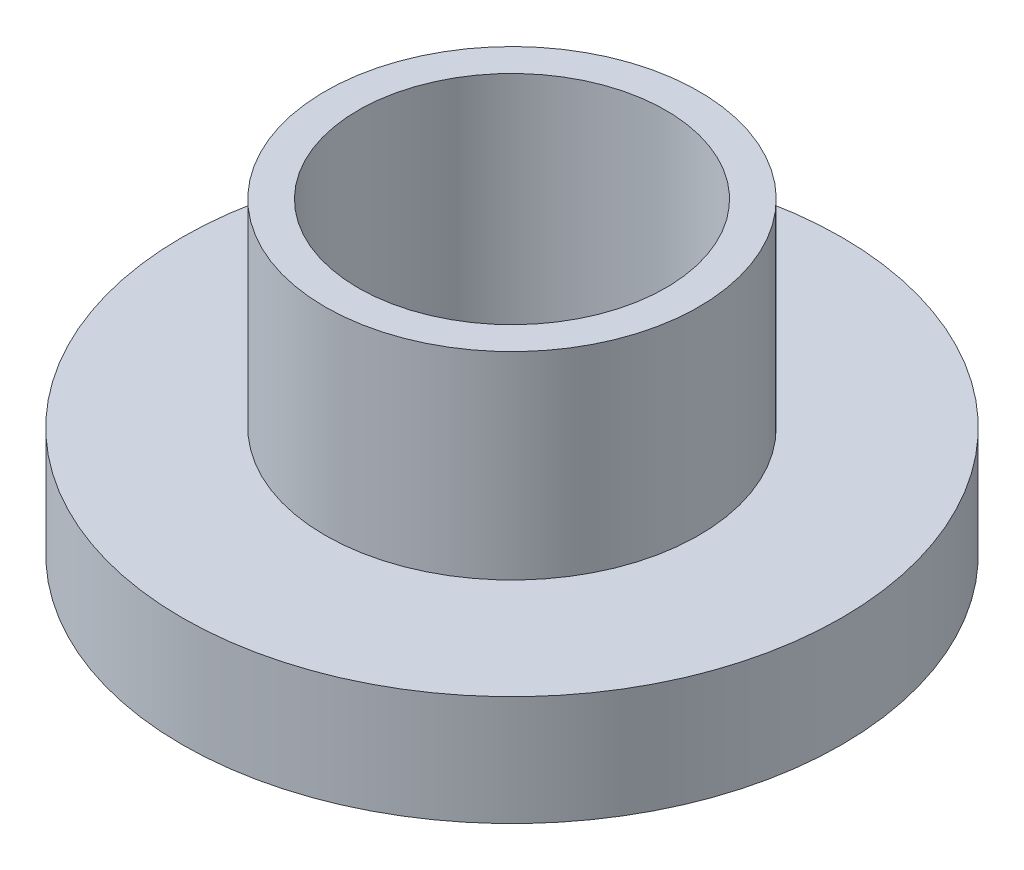
ISO-10303-21;
HEADER;
FILE_DESCRIPTION(('STEP AP214'),'2;1');
FILE_NAME('part.step','',(''),(''),'','','');
FILE_SCHEMA(('AUTOMOTIVE_DESIGN { 1 0 10303 214 1 1 1 1 }'));
ENDSEC;
DATA;
#1=APPLICATION_CONTEXT('core data for automotive mechanical design processes');
#2=APPLICATION_PROTOCOL_DEFINITION('international standard','automotive_design',2000,#1);
#3=PRODUCT_CONTEXT('',#1,'mechanical');
#4=PRODUCT('Part','Part','',(#3));
#5=PRODUCT_RELATED_PRODUCT_CATEGORY('part','',(#4));
#6=PRODUCT_DEFINITION_FORMATION('','',#4);
#7=PRODUCT_DEFINITION_CONTEXT('part definition',#1,'design');
#8=PRODUCT_DEFINITION('design','',#6,#7);
#9=PRODUCT_DEFINITION_SHAPE('','',#8);
#10=(LENGTH_UNIT() NAMED_UNIT(*) SI_UNIT(.MILLI.,.METRE.));
#11=(NAMED_UNIT(*) PLANE_ANGLE_UNIT() SI_UNIT($,.RADIAN.));
#12=(NAMED_UNIT(*) SI_UNIT($,.STERADIAN.) SOLID_ANGLE_UNIT());
#13=UNCERTAINTY_MEASURE_WITH_UNIT(LENGTH_MEASURE(1.E-05),#10,'distance_accuracy_value','');
#14=(GEOMETRIC_REPRESENTATION_CONTEXT(3) GLOBAL_UNCERTAINTY_ASSIGNED_CONTEXT((#13)) GLOBAL_UNIT_ASSIGNED_CONTEXT((#10,
#11,#12)) REPRESENTATION_CONTEXT('',''));
#15=CARTESIAN_POINT('',(0.,0.,0.));
#16=DIRECTION('',(0.,0.,1.));
#17=DIRECTION('',(1.,0.,0.));
#18=AXIS2_PLACEMENT_3D('',#15,#16,#17);
#19=CARTESIAN_POINT('',(0.,2.8,0.));
#20=DIRECTION('',(0.,-1.,0.));
#21=DIRECTION('',(0.,0.,-1.));
#22=AXIS2_PLACEMENT_3D('',#19,#20,#21);
#23=CYLINDRICAL_SURFACE('',#22,3.);
#24=CARTESIAN_POINT('',(0.,0.,0.));
#25=DIRECTION('',(0.,1.,0.));
#26=DIRECTION('',(0.,0.,1.));
#27=AXIS2_PLACEMENT_3D('',#24,#25,#26);
#28=CIRCLE('',#27,3.);
#29=CARTESIAN_POINT('',(0.,0.,3.));
#30=VERTEX_POINT('',#29);
#31=EDGE_CURVE('E12',#30,#30,#28,.T.);
#32=ORIENTED_EDGE('',*,*,#31,.T.);
#33=EDGE_LOOP('',(#32));
#34=FACE_BOUND('',#33,.T.);
#35=CARTESIAN_POINT('',(0.,1.,0.));
#36=DIRECTION('',(0.,1.,0.));
#37=DIRECTION('',(0.,0.,1.));
#38=AXIS2_PLACEMENT_3D('',#35,#36,#37);
#39=CIRCLE('',#38,3.);
#40=CARTESIAN_POINT('',(0.,1.,3.));
#41=VERTEX_POINT('',#40);
#42=EDGE_CURVE('E37',#41,#41,#39,.T.);
#43=ORIENTED_EDGE('',*,*,#42,.F.);
#44=EDGE_LOOP('',(#43));
#45=FACE_BOUND('',#44,.T.);
#46=ADVANCED_FACE('F34',(#34,#45),#23,.T.);
#47=CARTESIAN_POINT('',(0.,2.8,0.));
#48=DIRECTION('',(0.,1.,0.));
#49=DIRECTION('',(0.,0.,1.));
#50=AXIS2_PLACEMENT_3D('',#47,#48,#49);
#51=PLANE('',#50);
#52=CARTESIAN_POINT('',(0.,2.8,0.));
#53=DIRECTION('',(0.,1.,0.));
#54=DIRECTION('',(0.,0.,1.));
#55=AXIS2_PLACEMENT_3D('',#52,#53,#54);
#56=CIRCLE('',#55,1.4);
#57=CARTESIAN_POINT('',(0.,2.8,1.4));
#58=VERTEX_POINT('',#57);
#59=EDGE_CURVE('E45',#58,#58,#56,.T.);
#60=ORIENTED_EDGE('',*,*,#59,.F.);
#61=EDGE_LOOP('',(#60));
#62=FACE_BOUND('',#61,.T.);
#63=CARTESIAN_POINT('',(0.,2.8,0.));
#64=DIRECTION('',(0.,1.,0.));
#65=DIRECTION('',(0.,0.,1.));
#66=AXIS2_PLACEMENT_3D('',#63,#64,#65);
#67=CIRCLE('',#66,1.7);
#68=CARTESIAN_POINT('',(0.,2.8,1.7));
#69=VERTEX_POINT('',#68);
#70=EDGE_CURVE('E53',#69,#69,#67,.T.);
#71=ORIENTED_EDGE('',*,*,#70,.T.);
#72=EDGE_LOOP('',(#71));
#73=FACE_BOUND('',#72,.T.);
#74=ADVANCED_FACE('F57',(#62,#73),#51,.T.);
#75=CARTESIAN_POINT('',(0.,0.,0.));
#76=DIRECTION('',(0.,1.,0.));
#77=DIRECTION('',(0.,0.,1.));
#78=AXIS2_PLACEMENT_3D('',#75,#76,#77);
#79=PLANE('',#78);
#80=CARTESIAN_POINT('',(0.,0.,0.));
#81=DIRECTION('',(0.,1.,0.));
#82=DIRECTION('',(0.,0.,1.));
#83=AXIS2_PLACEMENT_3D('',#80,#81,#82);
#84=CIRCLE('',#83,1.4);
#85=CARTESIAN_POINT('',(0.,0.,1.4));
#86=VERTEX_POINT('',#85);
#87=EDGE_CURVE('E41',#86,#86,#84,.T.);
#88=ORIENTED_EDGE('',*,*,#87,.T.);
#89=EDGE_LOOP('',(#88));
#90=FACE_BOUND('',#89,.T.);
#91=ORIENTED_EDGE('',*,*,#31,.F.);
#92=EDGE_LOOP('',(#91));
#93=FACE_BOUND('',#92,.T.);
#94=ADVANCED_FACE('F76',(#90,#93),#79,.F.);
#95=CARTESIAN_POINT('',(0.,0.,0.));
#96=DIRECTION('',(0.,1.,0.));
#97=DIRECTION('',(0.,0.,1.));
#98=AXIS2_PLACEMENT_3D('',#95,#96,#97);
#99=CYLINDRICAL_SURFACE('',#98,1.4);
#100=ORIENTED_EDGE('',*,*,#87,.F.);
#101=EDGE_LOOP('',(#100));
#102=FACE_BOUND('',#101,.T.);
#103=ORIENTED_EDGE('',*,*,#59,.T.);
#104=EDGE_LOOP('',(#103));
#105=FACE_BOUND('',#104,.T.);
#106=ADVANCED_FACE('F67',(#102,#105),#99,.F.);
#107=CARTESIAN_POINT('',(0.,1.,0.));
#108=DIRECTION('',(0.,1.,0.));
#109=DIRECTION('',(0.,0.,1.));
#110=AXIS2_PLACEMENT_3D('',#107,#108,#109);
#111=PLANE('',#110);
#112=CARTESIAN_POINT('',(0.,1.,0.));
#113=DIRECTION('',(0.,1.,0.));
#114=DIRECTION('',(0.,0.,1.));
#115=AXIS2_PLACEMENT_3D('',#112,#113,#114);
#116=CIRCLE('',#115,1.7);
#117=CARTESIAN_POINT('',(0.,1.,1.7));
#118=VERTEX_POINT('',#117);
#119=EDGE_CURVE('E50',#118,#118,#116,.F.);
#120=ORIENTED_EDGE('',*,*,#119,.T.);
#121=EDGE_LOOP('',(#120));
#122=FACE_BOUND('',#121,.T.);
#123=ORIENTED_EDGE('',*,*,#42,.T.);
#124=EDGE_LOOP('',(#123));
#125=FACE_BOUND('',#124,.T.);
#126=ADVANCED_FACE('F61',(#122,#125),#111,.T.);
#127=CARTESIAN_POINT('',(0.,-8.62670273047588,0.));
#128=DIRECTION('',(0.,1.,0.));
#129=DIRECTION('',(0.,0.,1.));
#130=AXIS2_PLACEMENT_3D('',#127,#128,#129);
#131=CYLINDRICAL_SURFACE('',#130,1.7);
#132=ORIENTED_EDGE('',*,*,#119,.F.);
#133=EDGE_LOOP('',(#132));
#134=FACE_BOUND('',#133,.T.);
#135=ORIENTED_EDGE('',*,*,#70,.F.);
#136=EDGE_LOOP('',(#135));
#137=FACE_BOUND('',#136,.T.);
#138=ADVANCED_FACE('F59',(#134,#137),#131,.T.);
#139=CLOSED_SHELL('',(#46,#74,#94,#106,#126,#138));
#140=MANIFOLD_SOLID_BREP('B2',#139);
#141=ADVANCED_BREP_SHAPE_REPRESENTATION('',(#18,#140),#14);
#142=SHAPE_DEFINITION_REPRESENTATION(#9,#141);
ENDSEC;
END-ISO-10303-21;
